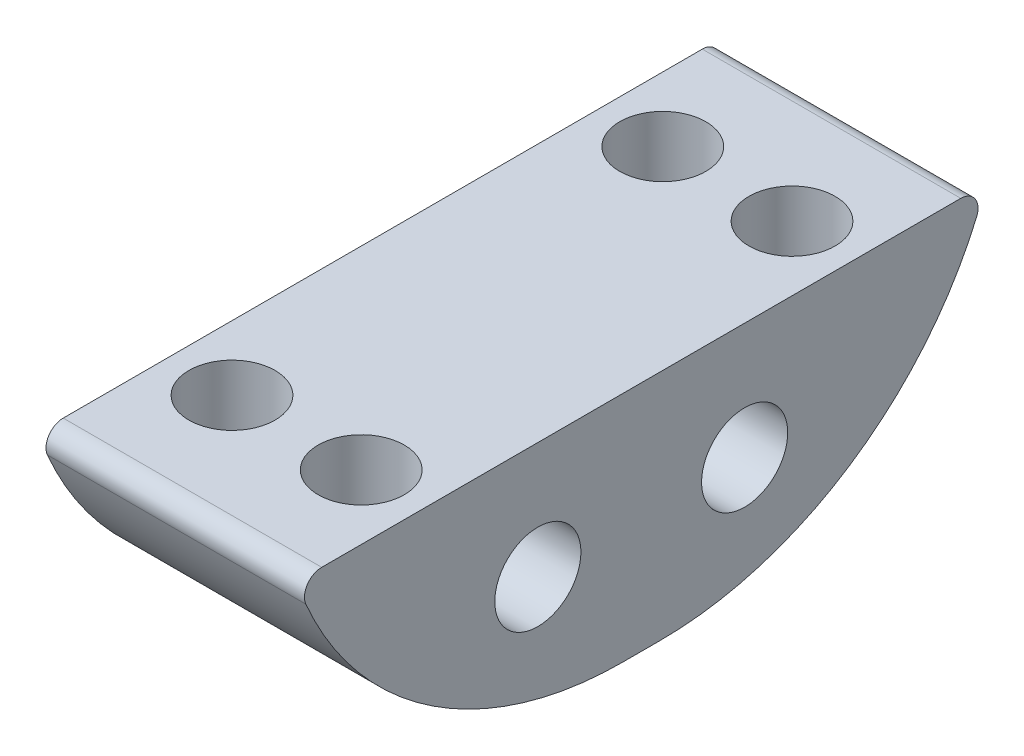
ISO-10303-21;
HEADER;
FILE_DESCRIPTION(('STEP AP214'),'2;1');
FILE_NAME('part.step','',(''),(''),'','','');
FILE_SCHEMA(('AUTOMOTIVE_DESIGN { 1 0 10303 214 1 1 1 1 }'));
ENDSEC;
DATA;
#1=APPLICATION_CONTEXT('core data for automotive mechanical design processes');
#2=APPLICATION_PROTOCOL_DEFINITION('international standard','automotive_design',2000,#1);
#3=PRODUCT_CONTEXT('',#1,'mechanical');
#4=PRODUCT('Part','Part','',(#3));
#5=PRODUCT_RELATED_PRODUCT_CATEGORY('part','',(#4));
#6=PRODUCT_DEFINITION_FORMATION('','',#4);
#7=PRODUCT_DEFINITION_CONTEXT('part definition',#1,'design');
#8=PRODUCT_DEFINITION('design','',#6,#7);
#9=PRODUCT_DEFINITION_SHAPE('','',#8);
#10=(LENGTH_UNIT() NAMED_UNIT(*) SI_UNIT(.MILLI.,.METRE.));
#11=(NAMED_UNIT(*) PLANE_ANGLE_UNIT() SI_UNIT($,.RADIAN.));
#12=(NAMED_UNIT(*) SI_UNIT($,.STERADIAN.) SOLID_ANGLE_UNIT());
#13=UNCERTAINTY_MEASURE_WITH_UNIT(LENGTH_MEASURE(1.E-05),#10,'distance_accuracy_value','');
#14=(GEOMETRIC_REPRESENTATION_CONTEXT(3) GLOBAL_UNCERTAINTY_ASSIGNED_CONTEXT((#13)) GLOBAL_UNIT_ASSIGNED_CONTEXT((#10,
#11,#12)) REPRESENTATION_CONTEXT('',''));
#15=CARTESIAN_POINT('',(0.,0.,0.));
#16=DIRECTION('',(0.,0.,1.));
#17=DIRECTION('',(1.,0.,0.));
#18=AXIS2_PLACEMENT_3D('',#15,#16,#17);
#19=CARTESIAN_POINT('',(15.,27.,40.));
#20=DIRECTION('',(-1.,0.,0.));
#21=DIRECTION('',(0.,0.,1.));
#22=AXIS2_PLACEMENT_3D('',#19,#20,#21);
#23=PLANE('',#22);
#24=DIRECTION('',(0.,0.,-1.));
#25=VECTOR('',#24,1.);
#26=CARTESIAN_POINT('',(15.,27.,40.));
#27=LINE('',#26,#25);
#28=CARTESIAN_POINT('',(15.,27.,37.0856198614367));
#29=VERTEX_POINT('',#28);
#30=CARTESIAN_POINT('',(15.,27.,-37.0856198614367));
#31=VERTEX_POINT('',#30);
#32=EDGE_CURVE('E114',#29,#31,#27,.T.);
#33=ORIENTED_EDGE('',*,*,#32,.F.);
#34=CARTESIAN_POINT('',(15.,25.,37.0856198614367));
#35=DIRECTION('',(-1.,0.,0.));
#36=DIRECTION('',(0.,0.,1.));
#37=AXIS2_PLACEMENT_3D('',#34,#35,#36);
#38=CIRCLE('',#37,2.);
#39=CARTESIAN_POINT('',(15.,24.2105263157895,38.9232083088152));
#40=VERTEX_POINT('',#39);
#41=EDGE_CURVE('E63',#29,#40,#38,.F.);
#42=ORIENTED_EDGE('',*,*,#41,.T.);
#43=CARTESIAN_POINT('',(15.,40.,2.17143936124452));
#44=DIRECTION('',(-1.,0.,0.));
#45=DIRECTION('',(0.,0.,1.));
#46=AXIS2_PLACEMENT_3D('',#43,#44,#45);
#47=CIRCLE('',#46,40.);
#48=CARTESIAN_POINT('',(15.,0.,2.17143936124452));
#49=VERTEX_POINT('',#48);
#50=EDGE_CURVE('E104',#40,#49,#47,.F.);
#51=ORIENTED_EDGE('',*,*,#50,.T.);
#52=DIRECTION('',(0.,0.,-1.));
#53=VECTOR('',#52,1.);
#54=CARTESIAN_POINT('',(15.,0.,40.));
#55=LINE('',#54,#53);
#56=CARTESIAN_POINT('',(15.,0.,-2.17143936124452));
#57=VERTEX_POINT('',#56);
#58=EDGE_CURVE('E115',#49,#57,#55,.T.);
#59=ORIENTED_EDGE('',*,*,#58,.T.);
#60=CARTESIAN_POINT('',(15.,40.,-2.17143936124452));
#61=DIRECTION('',(-1.,0.,0.));
#62=DIRECTION('',(0.,0.,1.));
#63=AXIS2_PLACEMENT_3D('',#60,#61,#62);
#64=CIRCLE('',#63,40.);
#65=CARTESIAN_POINT('',(15.,24.2105263157895,-38.9232083088152));
#66=VERTEX_POINT('',#65);
#67=EDGE_CURVE('E105',#57,#66,#64,.F.);
#68=ORIENTED_EDGE('',*,*,#67,.T.);
#69=CARTESIAN_POINT('',(15.,25.,-37.0856198614367));
#70=DIRECTION('',(-1.,0.,0.));
#71=DIRECTION('',(0.,0.,1.));
#72=AXIS2_PLACEMENT_3D('',#69,#70,#71);
#73=CIRCLE('',#72,2.);
#74=EDGE_CURVE('E134',#66,#31,#73,.F.);
#75=ORIENTED_EDGE('',*,*,#74,.T.);
#76=EDGE_LOOP('',(#33,#42,#51,#59,#68,#75));
#77=FACE_BOUND('',#76,.T.);
#78=CARTESIAN_POINT('',(15.,13.5,-12.));
#79=DIRECTION('',(-1.,0.,0.));
#80=DIRECTION('',(0.,0.,1.));
#81=AXIS2_PLACEMENT_3D('',#78,#79,#80);
#82=CIRCLE('',#81,5.);
#83=CARTESIAN_POINT('',(15.,13.5,-7.));
#84=VERTEX_POINT('',#83);
#85=EDGE_CURVE('E154',#84,#84,#82,.T.);
#86=ORIENTED_EDGE('',*,*,#85,.T.);
#87=EDGE_LOOP('',(#86));
#88=FACE_BOUND('',#87,.T.);
#89=CARTESIAN_POINT('',(15.,13.5,12.));
#90=DIRECTION('',(1.,0.,0.));
#91=DIRECTION('',(0.,0.,-1.));
#92=AXIS2_PLACEMENT_3D('',#89,#90,#91);
#93=CIRCLE('',#92,5.);
#94=CARTESIAN_POINT('',(15.,13.5,7.));
#95=VERTEX_POINT('',#94);
#96=EDGE_CURVE('E159',#95,#95,#93,.T.);
#97=ORIENTED_EDGE('',*,*,#96,.F.);
#98=EDGE_LOOP('',(#97));
#99=FACE_BOUND('',#98,.T.);
#100=ADVANCED_FACE('F41',(#77,#88,#99),#23,.F.);
#101=CARTESIAN_POINT('',(-15.,27.,40.));
#102=DIRECTION('',(-1.,0.,0.));
#103=DIRECTION('',(0.,0.,1.));
#104=AXIS2_PLACEMENT_3D('',#101,#102,#103);
#105=PLANE('',#104);
#106=CARTESIAN_POINT('',(-15.,13.5,-12.));
#107=DIRECTION('',(-1.,0.,0.));
#108=DIRECTION('',(0.,0.,1.));
#109=AXIS2_PLACEMENT_3D('',#106,#107,#108);
#110=CIRCLE('',#109,5.);
#111=CARTESIAN_POINT('',(-15.,13.5,-7.));
#112=VERTEX_POINT('',#111);
#113=EDGE_CURVE('E157',#112,#112,#110,.F.);
#114=ORIENTED_EDGE('',*,*,#113,.T.);
#115=EDGE_LOOP('',(#114));
#116=FACE_BOUND('',#115,.T.);
#117=CARTESIAN_POINT('',(-15.,40.,2.17143936124452));
#118=DIRECTION('',(-1.,0.,0.));
#119=DIRECTION('',(0.,0.,1.));
#120=AXIS2_PLACEMENT_3D('',#117,#118,#119);
#121=CIRCLE('',#120,40.);
#122=CARTESIAN_POINT('',(-15.,0.,2.17143936124452));
#123=VERTEX_POINT('',#122);
#124=CARTESIAN_POINT('',(-15.,24.2105263157895,38.9232083088152));
#125=VERTEX_POINT('',#124);
#126=EDGE_CURVE('E130',#123,#125,#121,.T.);
#127=ORIENTED_EDGE('',*,*,#126,.T.);
#128=CARTESIAN_POINT('',(-15.,25.,37.0856198614367));
#129=DIRECTION('',(-1.,0.,0.));
#130=DIRECTION('',(0.,0.,1.));
#131=AXIS2_PLACEMENT_3D('',#128,#129,#130);
#132=CIRCLE('',#131,2.);
#133=CARTESIAN_POINT('',(-15.,27.,37.0856198614367));
#134=VERTEX_POINT('',#133);
#135=EDGE_CURVE('E11',#125,#134,#132,.T.);
#136=ORIENTED_EDGE('',*,*,#135,.T.);
#137=DIRECTION('',(0.,0.,-1.));
#138=VECTOR('',#137,1.);
#139=CARTESIAN_POINT('',(-15.,27.,40.));
#140=LINE('',#139,#138);
#141=CARTESIAN_POINT('',(-15.,27.,-37.0856198614367));
#142=VERTEX_POINT('',#141);
#143=EDGE_CURVE('E120',#134,#142,#140,.T.);
#144=ORIENTED_EDGE('',*,*,#143,.T.);
#145=CARTESIAN_POINT('',(-15.,25.,-37.0856198614367));
#146=DIRECTION('',(-1.,0.,0.));
#147=DIRECTION('',(0.,0.,1.));
#148=AXIS2_PLACEMENT_3D('',#145,#146,#147);
#149=CIRCLE('',#148,2.);
#150=CARTESIAN_POINT('',(-15.,24.2105263157895,-38.9232083088152));
#151=VERTEX_POINT('',#150);
#152=EDGE_CURVE('E99',#142,#151,#149,.T.);
#153=ORIENTED_EDGE('',*,*,#152,.T.);
#154=CARTESIAN_POINT('',(-15.,40.,-2.17143936124452));
#155=DIRECTION('',(-1.,0.,0.));
#156=DIRECTION('',(0.,0.,1.));
#157=AXIS2_PLACEMENT_3D('',#154,#155,#156);
#158=CIRCLE('',#157,40.);
#159=CARTESIAN_POINT('',(-15.,0.,-2.17143936124452));
#160=VERTEX_POINT('',#159);
#161=EDGE_CURVE('E93',#151,#160,#158,.T.);
#162=ORIENTED_EDGE('',*,*,#161,.T.);
#163=DIRECTION('',(0.,0.,-1.));
#164=VECTOR('',#163,1.);
#165=CARTESIAN_POINT('',(-15.,0.,40.));
#166=LINE('',#165,#164);
#167=EDGE_CURVE('E97',#123,#160,#166,.T.);
#168=ORIENTED_EDGE('',*,*,#167,.F.);
#169=EDGE_LOOP('',(#127,#136,#144,#153,#162,#168));
#170=FACE_BOUND('',#169,.T.);
#171=CARTESIAN_POINT('',(-15.,13.5,12.));
#172=DIRECTION('',(-1.,0.,0.));
#173=DIRECTION('',(0.,0.,1.));
#174=AXIS2_PLACEMENT_3D('',#171,#172,#173);
#175=CIRCLE('',#174,5.);
#176=CARTESIAN_POINT('',(-15.,13.5,17.));
#177=VERTEX_POINT('',#176);
#178=EDGE_CURVE('E125',#177,#177,#175,.T.);
#179=ORIENTED_EDGE('',*,*,#178,.F.);
#180=EDGE_LOOP('',(#179));
#181=FACE_BOUND('',#180,.T.);
#182=ADVANCED_FACE('F95',(#116,#170,#181),#105,.T.);
#183=CARTESIAN_POINT('',(0.,27.,0.));
#184=DIRECTION('',(0.,1.,0.));
#185=DIRECTION('',(0.,0.,1.));
#186=AXIS2_PLACEMENT_3D('',#183,#184,#185);
#187=PLANE('',#186);
#188=CARTESIAN_POINT('',(-7.5,27.,25.));
#189=DIRECTION('',(0.,1.,0.));
#190=DIRECTION('',(0.,0.,-1.));
#191=AXIS2_PLACEMENT_3D('',#188,#189,#190);
#192=CIRCLE('',#191,5.);
#193=CARTESIAN_POINT('',(-7.5,27.,20.));
#194=VERTEX_POINT('',#193);
#195=EDGE_CURVE('E178',#194,#194,#192,.T.);
#196=ORIENTED_EDGE('',*,*,#195,.F.);
#197=EDGE_LOOP('',(#196));
#198=FACE_BOUND('',#197,.T.);
#199=CARTESIAN_POINT('',(7.49999999999999,27.,-25.));
#200=DIRECTION('',(0.,1.,0.));
#201=DIRECTION('',(0.,0.,1.));
#202=AXIS2_PLACEMENT_3D('',#199,#200,#201);
#203=CIRCLE('',#202,5.);
#204=CARTESIAN_POINT('',(7.49999999999999,27.,-20.));
#205=VERTEX_POINT('',#204);
#206=EDGE_CURVE('E184',#205,#205,#203,.T.);
#207=ORIENTED_EDGE('',*,*,#206,.F.);
#208=EDGE_LOOP('',(#207));
#209=FACE_BOUND('',#208,.T.);
#210=CARTESIAN_POINT('',(-7.5,27.,-25.));
#211=DIRECTION('',(0.,1.,0.));
#212=DIRECTION('',(0.,0.,1.));
#213=AXIS2_PLACEMENT_3D('',#210,#211,#212);
#214=CIRCLE('',#213,5.);
#215=CARTESIAN_POINT('',(-7.5,27.,-20.));
#216=VERTEX_POINT('',#215);
#217=EDGE_CURVE('E172',#216,#216,#214,.T.);
#218=ORIENTED_EDGE('',*,*,#217,.F.);
#219=EDGE_LOOP('',(#218));
#220=FACE_BOUND('',#219,.T.);
#221=CARTESIAN_POINT('',(7.49999999999999,27.,25.));
#222=DIRECTION('',(0.,1.,0.));
#223=DIRECTION('',(0.,0.,-1.));
#224=AXIS2_PLACEMENT_3D('',#221,#222,#223);
#225=CIRCLE('',#224,5.);
#226=CARTESIAN_POINT('',(7.49999999999999,27.,20.));
#227=VERTEX_POINT('',#226);
#228=EDGE_CURVE('E169',#227,#227,#225,.T.);
#229=ORIENTED_EDGE('',*,*,#228,.F.);
#230=EDGE_LOOP('',(#229));
#231=FACE_BOUND('',#230,.T.);
#232=ORIENTED_EDGE('',*,*,#143,.F.);
#233=DIRECTION('',(1.,0.,0.));
#234=VECTOR('',#233,1.);
#235=CARTESIAN_POINT('',(0.,27.,37.0856198614367));
#236=LINE('',#235,#234);
#237=EDGE_CURVE('E141',#134,#29,#236,.T.);
#238=ORIENTED_EDGE('',*,*,#237,.T.);
#239=ORIENTED_EDGE('',*,*,#32,.T.);
#240=DIRECTION('',(1.,0.,0.));
#241=VECTOR('',#240,1.);
#242=CARTESIAN_POINT('',(0.,27.,-37.0856198614367));
#243=LINE('',#242,#241);
#244=EDGE_CURVE('E137',#31,#142,#243,.F.);
#245=ORIENTED_EDGE('',*,*,#244,.T.);
#246=EDGE_LOOP('',(#232,#238,#239,#245));
#247=FACE_BOUND('',#246,.T.);
#248=ADVANCED_FACE('F147',(#198,#209,#220,#231,#247),#187,.T.);
#249=CARTESIAN_POINT('',(0.,0.,0.));
#250=DIRECTION('',(0.,1.,0.));
#251=DIRECTION('',(0.,0.,1.));
#252=AXIS2_PLACEMENT_3D('',#249,#250,#251);
#253=PLANE('',#252);
#254=ORIENTED_EDGE('',*,*,#58,.F.);
#255=DIRECTION('',(1.,0.,0.));
#256=VECTOR('',#255,1.);
#257=CARTESIAN_POINT('',(0.,0.,2.17143936124452));
#258=LINE('',#257,#256);
#259=EDGE_CURVE('E113',#49,#123,#258,.F.);
#260=ORIENTED_EDGE('',*,*,#259,.T.);
#261=ORIENTED_EDGE('',*,*,#167,.T.);
#262=DIRECTION('',(1.,0.,0.));
#263=VECTOR('',#262,1.);
#264=CARTESIAN_POINT('',(0.,0.,-2.17143936124452));
#265=LINE('',#264,#263);
#266=EDGE_CURVE('E111',#160,#57,#265,.T.);
#267=ORIENTED_EDGE('',*,*,#266,.T.);
#268=EDGE_LOOP('',(#254,#260,#261,#267));
#269=FACE_BOUND('',#268,.T.);
#270=ADVANCED_FACE('F110',(#269),#253,.F.);
#271=CARTESIAN_POINT('',(-25.,13.5,-12.));
#272=DIRECTION('',(1.,0.,0.));
#273=DIRECTION('',(0.,0.,-1.));
#274=AXIS2_PLACEMENT_3D('',#271,#272,#273);
#275=CYLINDRICAL_SURFACE('',#274,5.);
#276=ORIENTED_EDGE('',*,*,#113,.F.);
#277=EDGE_LOOP('',(#276));
#278=FACE_BOUND('',#277,.T.);
#279=ORIENTED_EDGE('',*,*,#85,.F.);
#280=EDGE_LOOP('',(#279));
#281=FACE_BOUND('',#280,.T.);
#282=ADVANCED_FACE('F360',(#278,#281),#275,.F.);
#283=CARTESIAN_POINT('',(-25.,13.5,12.));
#284=DIRECTION('',(1.,0.,0.));
#285=DIRECTION('',(0.,0.,-1.));
#286=AXIS2_PLACEMENT_3D('',#283,#284,#285);
#287=CYLINDRICAL_SURFACE('',#286,5.);
#288=ORIENTED_EDGE('',*,*,#178,.T.);
#289=EDGE_LOOP('',(#288));
#290=FACE_BOUND('',#289,.T.);
#291=ORIENTED_EDGE('',*,*,#96,.T.);
#292=EDGE_LOOP('',(#291));
#293=FACE_BOUND('',#292,.T.);
#294=ADVANCED_FACE('F226',(#290,#293),#287,.F.);
#295=CARTESIAN_POINT('',(-15.,40.,-2.17143936124452));
#296=DIRECTION('',(1.,0.,0.));
#297=DIRECTION('',(0.,0.,-1.));
#298=AXIS2_PLACEMENT_3D('',#295,#296,#297);
#299=CYLINDRICAL_SURFACE('',#298,40.);
#300=ORIENTED_EDGE('',*,*,#161,.F.);
#301=DIRECTION('',(1.,0.,0.));
#302=VECTOR('',#301,1.);
#303=CARTESIAN_POINT('',(-15.,24.2105263157895,-38.9232083088152));
#304=LINE('',#303,#302);
#305=EDGE_CURVE('E132',#151,#66,#304,.T.);
#306=ORIENTED_EDGE('',*,*,#305,.T.);
#307=ORIENTED_EDGE('',*,*,#67,.F.);
#308=ORIENTED_EDGE('',*,*,#266,.F.);
#309=EDGE_LOOP('',(#300,#306,#307,#308));
#310=FACE_BOUND('',#309,.T.);
#311=ADVANCED_FACE('F118',(#310),#299,.T.);
#312=CARTESIAN_POINT('',(-15.,40.,2.17143936124452));
#313=DIRECTION('',(1.,0.,0.));
#314=DIRECTION('',(0.,0.,-1.));
#315=AXIS2_PLACEMENT_3D('',#312,#313,#314);
#316=CYLINDRICAL_SURFACE('',#315,40.);
#317=ORIENTED_EDGE('',*,*,#50,.F.);
#318=DIRECTION('',(1.,0.,0.));
#319=VECTOR('',#318,1.);
#320=CARTESIAN_POINT('',(-15.,24.2105263157895,38.9232083088152));
#321=LINE('',#320,#319);
#322=EDGE_CURVE('E49',#40,#125,#321,.F.);
#323=ORIENTED_EDGE('',*,*,#322,.T.);
#324=ORIENTED_EDGE('',*,*,#126,.F.);
#325=ORIENTED_EDGE('',*,*,#259,.F.);
#326=EDGE_LOOP('',(#317,#323,#324,#325));
#327=FACE_BOUND('',#326,.T.);
#328=ADVANCED_FACE('F225',(#327),#316,.T.);
#329=CARTESIAN_POINT('',(-15.,25.,-37.0856198614367));
#330=DIRECTION('',(1.,0.,0.));
#331=DIRECTION('',(0.,0.,-1.));
#332=AXIS2_PLACEMENT_3D('',#329,#330,#331);
#333=CYLINDRICAL_SURFACE('',#332,2.);
#334=ORIENTED_EDGE('',*,*,#152,.F.);
#335=ORIENTED_EDGE('',*,*,#244,.F.);
#336=ORIENTED_EDGE('',*,*,#74,.F.);
#337=ORIENTED_EDGE('',*,*,#305,.F.);
#338=EDGE_LOOP('',(#334,#335,#336,#337));
#339=FACE_BOUND('',#338,.T.);
#340=ADVANCED_FACE('F212',(#339),#333,.T.);
#341=CARTESIAN_POINT('',(-15.,25.,37.0856198614367));
#342=DIRECTION('',(1.,0.,0.));
#343=DIRECTION('',(0.,0.,-1.));
#344=AXIS2_PLACEMENT_3D('',#341,#342,#343);
#345=CYLINDRICAL_SURFACE('',#344,2.);
#346=ORIENTED_EDGE('',*,*,#135,.F.);
#347=ORIENTED_EDGE('',*,*,#322,.F.);
#348=ORIENTED_EDGE('',*,*,#41,.F.);
#349=ORIENTED_EDGE('',*,*,#237,.F.);
#350=EDGE_LOOP('',(#346,#347,#348,#349));
#351=FACE_BOUND('',#350,.T.);
#352=ADVANCED_FACE('F43',(#351),#345,.T.);
#353=CARTESIAN_POINT('',(7.49999999999999,17.,25.));
#354=DIRECTION('',(0.,1.,0.));
#355=DIRECTION('',(0.,0.,1.));
#356=AXIS2_PLACEMENT_3D('',#353,#354,#355);
#357=CYLINDRICAL_SURFACE('',#356,5.);
#358=CARTESIAN_POINT('',(7.49999999999999,17.,25.));
#359=DIRECTION('',(0.,1.,0.));
#360=DIRECTION('',(0.,0.,-1.));
#361=AXIS2_PLACEMENT_3D('',#358,#359,#360);
#362=CIRCLE('',#361,5.);
#363=CARTESIAN_POINT('',(7.49999999999999,17.,20.));
#364=VERTEX_POINT('',#363);
#365=EDGE_CURVE('E167',#364,#364,#362,.T.);
#366=ORIENTED_EDGE('',*,*,#365,.F.);
#367=EDGE_LOOP('',(#366));
#368=FACE_BOUND('',#367,.T.);
#369=ORIENTED_EDGE('',*,*,#228,.T.);
#370=EDGE_LOOP('',(#369));
#371=FACE_BOUND('',#370,.T.);
#372=ADVANCED_FACE('F201',(#368,#371),#357,.F.);
#373=CARTESIAN_POINT('',(7.49999999999999,17.,25.));
#374=DIRECTION('',(0.,-1.,0.));
#375=DIRECTION('',(0.,0.,-1.));
#376=AXIS2_PLACEMENT_3D('',#373,#374,#375);
#377=PLANE('',#376);
#378=ORIENTED_EDGE('',*,*,#365,.T.);
#379=EDGE_LOOP('',(#378));
#380=FACE_BOUND('',#379,.T.);
#381=ADVANCED_FACE('F203',(#380),#377,.F.);
#382=CARTESIAN_POINT('',(-7.5,17.,-25.));
#383=DIRECTION('',(0.,1.,0.));
#384=DIRECTION('',(0.,0.,1.));
#385=AXIS2_PLACEMENT_3D('',#382,#383,#384);
#386=CYLINDRICAL_SURFACE('',#385,5.);
#387=CARTESIAN_POINT('',(-7.5,17.,-25.));
#388=DIRECTION('',(0.,1.,0.));
#389=DIRECTION('',(0.,0.,1.));
#390=AXIS2_PLACEMENT_3D('',#387,#388,#389);
#391=CIRCLE('',#390,5.);
#392=CARTESIAN_POINT('',(-7.5,17.,-20.));
#393=VERTEX_POINT('',#392);
#394=EDGE_CURVE('E187',#393,#393,#391,.T.);
#395=ORIENTED_EDGE('',*,*,#394,.F.);
#396=EDGE_LOOP('',(#395));
#397=FACE_BOUND('',#396,.T.);
#398=ORIENTED_EDGE('',*,*,#217,.T.);
#399=EDGE_LOOP('',(#398));
#400=FACE_BOUND('',#399,.T.);
#401=ADVANCED_FACE('F193',(#397,#400),#386,.F.);
#402=CARTESIAN_POINT('',(-7.5,17.,-25.));
#403=DIRECTION('',(0.,1.,0.));
#404=DIRECTION('',(0.,0.,1.));
#405=AXIS2_PLACEMENT_3D('',#402,#403,#404);
#406=PLANE('',#405);
#407=ORIENTED_EDGE('',*,*,#394,.T.);
#408=EDGE_LOOP('',(#407));
#409=FACE_BOUND('',#408,.T.);
#410=ADVANCED_FACE('F273',(#409),#406,.T.);
#411=CARTESIAN_POINT('',(7.49999999999999,17.,-25.));
#412=DIRECTION('',(0.,1.,0.));
#413=DIRECTION('',(0.,0.,1.));
#414=AXIS2_PLACEMENT_3D('',#411,#412,#413);
#415=CYLINDRICAL_SURFACE('',#414,5.);
#416=CARTESIAN_POINT('',(7.49999999999999,17.,-25.));
#417=DIRECTION('',(0.,1.,0.));
#418=DIRECTION('',(0.,0.,1.));
#419=AXIS2_PLACEMENT_3D('',#416,#417,#418);
#420=CIRCLE('',#419,5.);
#421=CARTESIAN_POINT('',(7.49999999999999,17.,-20.));
#422=VERTEX_POINT('',#421);
#423=EDGE_CURVE('E181',#422,#422,#420,.T.);
#424=ORIENTED_EDGE('',*,*,#423,.F.);
#425=EDGE_LOOP('',(#424));
#426=FACE_BOUND('',#425,.T.);
#427=ORIENTED_EDGE('',*,*,#206,.T.);
#428=EDGE_LOOP('',(#427));
#429=FACE_BOUND('',#428,.T.);
#430=ADVANCED_FACE('F284',(#426,#429),#415,.F.);
#431=CARTESIAN_POINT('',(7.49999999999999,17.,-25.));
#432=DIRECTION('',(0.,1.,0.));
#433=DIRECTION('',(0.,0.,1.));
#434=AXIS2_PLACEMENT_3D('',#431,#432,#433);
#435=PLANE('',#434);
#436=ORIENTED_EDGE('',*,*,#423,.T.);
#437=EDGE_LOOP('',(#436));
#438=FACE_BOUND('',#437,.T.);
#439=ADVANCED_FACE('F295',(#438),#435,.T.);
#440=CARTESIAN_POINT('',(-7.5,17.,25.));
#441=DIRECTION('',(0.,1.,0.));
#442=DIRECTION('',(0.,0.,1.));
#443=AXIS2_PLACEMENT_3D('',#440,#441,#442);
#444=CYLINDRICAL_SURFACE('',#443,5.);
#445=CARTESIAN_POINT('',(-7.5,17.,25.));
#446=DIRECTION('',(0.,1.,0.));
#447=DIRECTION('',(0.,0.,-1.));
#448=AXIS2_PLACEMENT_3D('',#445,#446,#447);
#449=CIRCLE('',#448,5.);
#450=CARTESIAN_POINT('',(-7.5,17.,20.));
#451=VERTEX_POINT('',#450);
#452=EDGE_CURVE('E175',#451,#451,#449,.T.);
#453=ORIENTED_EDGE('',*,*,#452,.F.);
#454=EDGE_LOOP('',(#453));
#455=FACE_BOUND('',#454,.T.);
#456=ORIENTED_EDGE('',*,*,#195,.T.);
#457=EDGE_LOOP('',(#456));
#458=FACE_BOUND('',#457,.T.);
#459=ADVANCED_FACE('F306',(#455,#458),#444,.F.);
#460=CARTESIAN_POINT('',(-7.5,17.,25.));
#461=DIRECTION('',(0.,-1.,0.));
#462=DIRECTION('',(0.,0.,-1.));
#463=AXIS2_PLACEMENT_3D('',#460,#461,#462);
#464=PLANE('',#463);
#465=ORIENTED_EDGE('',*,*,#452,.T.);
#466=EDGE_LOOP('',(#465));
#467=FACE_BOUND('',#466,.T.);
#468=ADVANCED_FACE('F317',(#467),#464,.F.);
#469=CLOSED_SHELL('',(#100,#182,#248,#270,#282,#294,#311,#328,#340,#352,#372,#381,#401,#410,
#430,#439,#459,#468));
#470=MANIFOLD_SOLID_BREP('B2',#469);
#471=ADVANCED_BREP_SHAPE_REPRESENTATION('',(#18,#470),#14);
#472=SHAPE_DEFINITION_REPRESENTATION(#9,#471);
ENDSEC;
END-ISO-10303-21;
